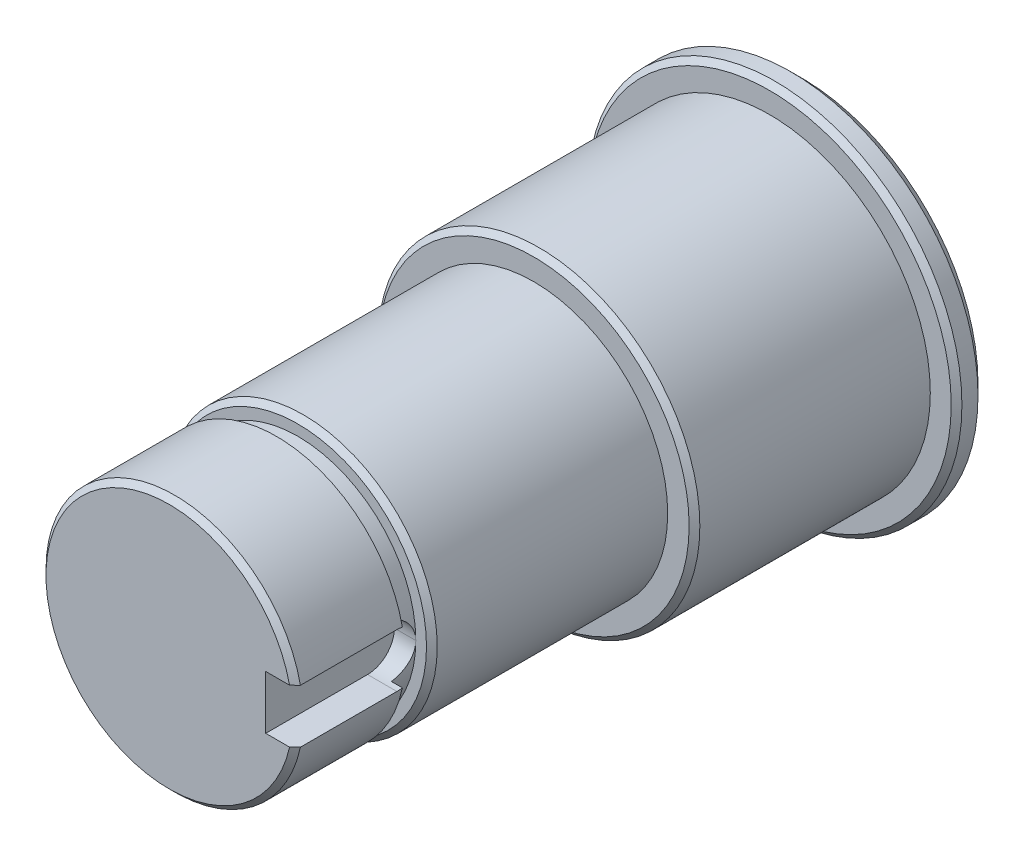
ISO-10303-21;
HEADER;
FILE_DESCRIPTION(('STEP AP214'),'2;1');
FILE_NAME('part.step','',(''),(''),'','','');
FILE_SCHEMA(('AUTOMOTIVE_DESIGN { 1 0 10303 214 1 1 1 1 }'));
ENDSEC;
DATA;
#1=APPLICATION_CONTEXT('core data for automotive mechanical design processes');
#2=APPLICATION_PROTOCOL_DEFINITION('international standard','automotive_design',2000,#1);
#3=PRODUCT_CONTEXT('',#1,'mechanical');
#4=PRODUCT('Part','Part','',(#3));
#5=PRODUCT_RELATED_PRODUCT_CATEGORY('part','',(#4));
#6=PRODUCT_DEFINITION_FORMATION('','',#4);
#7=PRODUCT_DEFINITION_CONTEXT('part definition',#1,'design');
#8=PRODUCT_DEFINITION('design','',#6,#7);
#9=PRODUCT_DEFINITION_SHAPE('','',#8);
#10=(LENGTH_UNIT() NAMED_UNIT(*) SI_UNIT(.MILLI.,.METRE.));
#11=(NAMED_UNIT(*) PLANE_ANGLE_UNIT() SI_UNIT($,.RADIAN.));
#12=(NAMED_UNIT(*) SI_UNIT($,.STERADIAN.) SOLID_ANGLE_UNIT());
#13=UNCERTAINTY_MEASURE_WITH_UNIT(LENGTH_MEASURE(1.E-05),#10,'distance_accuracy_value','');
#14=(GEOMETRIC_REPRESENTATION_CONTEXT(3) GLOBAL_UNCERTAINTY_ASSIGNED_CONTEXT((#13)) GLOBAL_UNIT_ASSIGNED_CONTEXT((#10,
#11,#12)) REPRESENTATION_CONTEXT('',''));
#15=CARTESIAN_POINT('',(0.,0.,0.));
#16=DIRECTION('',(0.,0.,1.));
#17=DIRECTION('',(1.,0.,0.));
#18=AXIS2_PLACEMENT_3D('',#15,#16,#17);
#19=CARTESIAN_POINT('',(0.,0.,47.));
#20=DIRECTION('',(0.,0.,1.));
#21=DIRECTION('',(1.,0.,0.));
#22=AXIS2_PLACEMENT_3D('',#19,#20,#21);
#23=PLANE('',#22);
#24=CARTESIAN_POINT('',(0.,0.,47.));
#25=DIRECTION('',(0.,0.,1.));
#26=DIRECTION('',(1.,0.,0.));
#27=AXIS2_PLACEMENT_3D('',#24,#25,#26);
#28=CIRCLE('',#27,11.);
#29=CARTESIAN_POINT('',(11.,0.,47.));
#30=VERTEX_POINT('',#29);
#31=EDGE_CURVE('E269',#30,#30,#28,.T.);
#32=ORIENTED_EDGE('',*,*,#31,.F.);
#33=EDGE_LOOP('',(#32));
#34=FACE_BOUND('',#33,.T.);
#35=CARTESIAN_POINT('',(0.,0.,47.));
#36=DIRECTION('',(0.,0.,1.));
#37=DIRECTION('',(1.,0.,0.));
#38=AXIS2_PLACEMENT_3D('',#35,#36,#37);
#39=CIRCLE('',#38,12.);
#40=CARTESIAN_POINT('',(12.,0.,47.));
#41=VERTEX_POINT('',#40);
#42=EDGE_CURVE('E233',#41,#41,#39,.T.);
#43=ORIENTED_EDGE('',*,*,#42,.T.);
#44=EDGE_LOOP('',(#43));
#45=FACE_BOUND('',#44,.T.);
#46=ADVANCED_FACE('F30',(#34,#45),#23,.T.);
#47=CARTESIAN_POINT('',(0.,0.,25.));
#48=DIRECTION('',(0.,0.,1.));
#49=DIRECTION('',(1.,0.,0.));
#50=AXIS2_PLACEMENT_3D('',#47,#48,#49);
#51=PLANE('',#50);
#52=CARTESIAN_POINT('',(0.,0.,25.));
#53=DIRECTION('',(0.,0.,1.));
#54=DIRECTION('',(1.,0.,0.));
#55=AXIS2_PLACEMENT_3D('',#52,#53,#54);
#56=CIRCLE('',#55,14.5);
#57=CARTESIAN_POINT('',(14.5,0.,25.));
#58=VERTEX_POINT('',#57);
#59=EDGE_CURVE('E220',#58,#58,#56,.T.);
#60=ORIENTED_EDGE('',*,*,#59,.T.);
#61=EDGE_LOOP('',(#60));
#62=FACE_BOUND('',#61,.T.);
#63=CARTESIAN_POINT('',(0.,0.,25.));
#64=DIRECTION('',(0.,0.,1.));
#65=DIRECTION('',(1.,0.,0.));
#66=AXIS2_PLACEMENT_3D('',#63,#64,#65);
#67=CIRCLE('',#66,12.5);
#68=CARTESIAN_POINT('',(12.5,0.,25.));
#69=VERTEX_POINT('',#68);
#70=EDGE_CURVE('E277',#69,#69,#67,.T.);
#71=ORIENTED_EDGE('',*,*,#70,.F.);
#72=EDGE_LOOP('',(#71));
#73=FACE_BOUND('',#72,.T.);
#74=ADVANCED_FACE('F187',(#62,#73),#51,.T.);
#75=CARTESIAN_POINT('',(0.,0.,3.));
#76=DIRECTION('',(0.,0.,1.));
#77=DIRECTION('',(1.,0.,0.));
#78=AXIS2_PLACEMENT_3D('',#75,#76,#77);
#79=PLANE('',#78);
#80=CARTESIAN_POINT('',(0.,0.,3.));
#81=DIRECTION('',(0.,0.,1.));
#82=DIRECTION('',(1.,0.,0.));
#83=AXIS2_PLACEMENT_3D('',#80,#81,#82);
#84=CIRCLE('',#83,16.95);
#85=CARTESIAN_POINT('',(16.95,0.,3.));
#86=VERTEX_POINT('',#85);
#87=EDGE_CURVE('E221',#86,#86,#84,.T.);
#88=ORIENTED_EDGE('',*,*,#87,.T.);
#89=EDGE_LOOP('',(#88));
#90=FACE_BOUND('',#89,.T.);
#91=CARTESIAN_POINT('',(0.,0.,3.));
#92=DIRECTION('',(0.,0.,1.));
#93=DIRECTION('',(1.,0.,0.));
#94=AXIS2_PLACEMENT_3D('',#91,#92,#93);
#95=CIRCLE('',#94,15.);
#96=CARTESIAN_POINT('',(15.,0.,3.));
#97=VERTEX_POINT('',#96);
#98=EDGE_CURVE('E280',#97,#97,#95,.T.);
#99=ORIENTED_EDGE('',*,*,#98,.F.);
#100=EDGE_LOOP('',(#99));
#101=FACE_BOUND('',#100,.T.);
#102=ADVANCED_FACE('F196',(#90,#101),#79,.T.);
#103=CARTESIAN_POINT('',(0.,0.,3.));
#104=DIRECTION('',(0.,0.,-1.));
#105=DIRECTION('',(-1.,0.,0.));
#106=AXIS2_PLACEMENT_3D('',#103,#104,#105);
#107=CYLINDRICAL_SURFACE('',#106,17.45);
#108=CARTESIAN_POINT('',(0.,0.,1.));
#109=DIRECTION('',(0.,0.,1.));
#110=DIRECTION('',(1.,0.,0.));
#111=AXIS2_PLACEMENT_3D('',#108,#109,#110);
#112=CIRCLE('',#111,17.45);
#113=CARTESIAN_POINT('',(17.45,0.,1.));
#114=VERTEX_POINT('',#113);
#115=EDGE_CURVE('E215',#114,#114,#112,.T.);
#116=ORIENTED_EDGE('',*,*,#115,.T.);
#117=EDGE_LOOP('',(#116));
#118=FACE_BOUND('',#117,.T.);
#119=CARTESIAN_POINT('',(0.,0.,2.50000000000002));
#120=DIRECTION('',(0.,0.,1.));
#121=DIRECTION('',(1.,0.,0.));
#122=AXIS2_PLACEMENT_3D('',#119,#120,#121);
#123=CIRCLE('',#122,17.45);
#124=CARTESIAN_POINT('',(17.45,0.,2.50000000000002));
#125=VERTEX_POINT('',#124);
#126=EDGE_CURVE('E218',#125,#125,#123,.F.);
#127=ORIENTED_EDGE('',*,*,#126,.T.);
#128=EDGE_LOOP('',(#127));
#129=FACE_BOUND('',#128,.T.);
#130=ADVANCED_FACE('F204',(#118,#129),#107,.T.);
#131=CARTESIAN_POINT('',(0.,0.,0.));
#132=DIRECTION('',(0.,0.,1.));
#133=DIRECTION('',(1.,0.,0.));
#134=AXIS2_PLACEMENT_3D('',#131,#132,#133);
#135=PLANE('',#134);
#136=CARTESIAN_POINT('',(0.,0.,0.));
#137=DIRECTION('',(0.,0.,1.));
#138=DIRECTION('',(1.,0.,0.));
#139=AXIS2_PLACEMENT_3D('',#136,#137,#138);
#140=CIRCLE('',#139,16.45);
#141=CARTESIAN_POINT('',(16.45,0.,0.));
#142=VERTEX_POINT('',#141);
#143=EDGE_CURVE('E240',#142,#142,#140,.F.);
#144=ORIENTED_EDGE('',*,*,#143,.T.);
#145=EDGE_LOOP('',(#144));
#146=FACE_BOUND('',#145,.T.);
#147=ADVANCED_FACE('F200',(#146),#135,.F.);
#148=CARTESIAN_POINT('',(0.,0.,25.));
#149=DIRECTION('',(0.,0.,-1.));
#150=DIRECTION('',(-1.,0.,0.));
#151=AXIS2_PLACEMENT_3D('',#148,#149,#150);
#152=CYLINDRICAL_SURFACE('',#151,15.);
#153=CARTESIAN_POINT('',(0.,0.,24.5));
#154=DIRECTION('',(0.,0.,1.));
#155=DIRECTION('',(1.,0.,0.));
#156=AXIS2_PLACEMENT_3D('',#153,#154,#155);
#157=CIRCLE('',#156,15.);
#158=CARTESIAN_POINT('',(15.,0.,24.5));
#159=VERTEX_POINT('',#158);
#160=EDGE_CURVE('E224',#159,#159,#157,.F.);
#161=ORIENTED_EDGE('',*,*,#160,.T.);
#162=EDGE_LOOP('',(#161));
#163=FACE_BOUND('',#162,.T.);
#164=ORIENTED_EDGE('',*,*,#98,.T.);
#165=EDGE_LOOP('',(#164));
#166=FACE_BOUND('',#165,.T.);
#167=ADVANCED_FACE('F192',(#163,#166),#152,.T.);
#168=CARTESIAN_POINT('',(0.,0.,47.));
#169=DIRECTION('',(0.,0.,-1.));
#170=DIRECTION('',(-1.,0.,0.));
#171=AXIS2_PLACEMENT_3D('',#168,#169,#170);
#172=CYLINDRICAL_SURFACE('',#171,12.5);
#173=CARTESIAN_POINT('',(0.,0.,46.5));
#174=DIRECTION('',(0.,0.,1.));
#175=DIRECTION('',(1.,0.,0.));
#176=AXIS2_PLACEMENT_3D('',#173,#174,#175);
#177=CIRCLE('',#176,12.5);
#178=CARTESIAN_POINT('',(12.5,0.,46.5));
#179=VERTEX_POINT('',#178);
#180=EDGE_CURVE('E236',#179,#179,#177,.F.);
#181=ORIENTED_EDGE('',*,*,#180,.T.);
#182=EDGE_LOOP('',(#181));
#183=FACE_BOUND('',#182,.T.);
#184=ORIENTED_EDGE('',*,*,#70,.T.);
#185=EDGE_LOOP('',(#184));
#186=FACE_BOUND('',#185,.T.);
#187=ADVANCED_FACE('F189',(#183,#186),#172,.T.);
#188=CARTESIAN_POINT('',(-12.,0.,49.));
#189=DIRECTION('',(0.,0.,-1.));
#190=DIRECTION('',(-1.,0.,0.));
#191=AXIS2_PLACEMENT_3D('',#188,#189,#190);
#192=PLANE('',#191);
#193=CARTESIAN_POINT('',(0.,0.,49.));
#194=DIRECTION('',(0.,0.,1.));
#195=DIRECTION('',(1.,0.,0.));
#196=AXIS2_PLACEMENT_3D('',#193,#194,#195);
#197=CIRCLE('',#196,12.);
#198=CARTESIAN_POINT('',(11.7473401244707,2.44948974278318,49.));
#199=VERTEX_POINT('',#198);
#200=CARTESIAN_POINT('',(11.7473401244707,-2.44948974278318,49.));
#201=VERTEX_POINT('',#200);
#202=EDGE_CURVE('E53',#199,#201,#197,.T.);
#203=ORIENTED_EDGE('',*,*,#202,.F.);
#204=DIRECTION('',(1.,0.,0.));
#205=VECTOR('',#204,1.);
#206=CARTESIAN_POINT('',(11.7473401244707,2.44948974278318,49.));
#207=LINE('',#206,#205);
#208=CARTESIAN_POINT('',(10.7238052947636,2.44948974278318,49.));
#209=VERTEX_POINT('',#208);
#210=EDGE_CURVE('E40',#199,#209,#207,.F.);
#211=ORIENTED_EDGE('',*,*,#210,.T.);
#212=CARTESIAN_POINT('',(0.,0.,49.));
#213=DIRECTION('',(0.,0.,1.));
#214=DIRECTION('',(1.,0.,0.));
#215=AXIS2_PLACEMENT_3D('',#212,#213,#214);
#216=CIRCLE('',#215,11.);
#217=CARTESIAN_POINT('',(10.7238052947636,-2.44948974278318,49.));
#218=VERTEX_POINT('',#217);
#219=EDGE_CURVE('E46',#209,#218,#216,.T.);
#220=ORIENTED_EDGE('',*,*,#219,.T.);
#221=DIRECTION('',(1.,0.,0.));
#222=VECTOR('',#221,1.);
#223=CARTESIAN_POINT('',(10.7238052947636,-2.44948974278318,49.));
#224=LINE('',#223,#222);
#225=EDGE_CURVE('E251',#218,#201,#224,.T.);
#226=ORIENTED_EDGE('',*,*,#225,.T.);
#227=EDGE_LOOP('',(#203,#211,#220,#226));
#228=FACE_BOUND('',#227,.T.);
#229=ADVANCED_FACE('F153',(#228),#192,.T.);
#230=CARTESIAN_POINT('',(0.,0.,47.));
#231=DIRECTION('',(0.,0.,1.));
#232=DIRECTION('',(1.,0.,0.));
#233=AXIS2_PLACEMENT_3D('',#230,#231,#232);
#234=CYLINDRICAL_SURFACE('',#233,11.);
#235=ORIENTED_EDGE('',*,*,#219,.F.);
#236=CARTESIAN_POINT('',(10.7238052947636,2.44948974278318,49.));
#237=CARTESIAN_POINT('',(10.7270051705199,2.43546225899013,48.931243733876));
#238=CARTESIAN_POINT('',(10.7308472430649,2.4185332172087,48.863116600116));
#239=CARTESIAN_POINT('',(10.7396733144426,2.37904398302326,48.7286032390526));
#240=CARTESIAN_POINT('',(10.7446571019522,2.35648483264184,48.6622166921103));
#241=CARTESIAN_POINT('',(10.7556191746092,2.30593085549429,48.5317157686606));
#242=CARTESIAN_POINT('',(10.7615963199518,2.27794225253788,48.4675988889972));
#243=CARTESIAN_POINT('',(10.7743690019728,2.21674323751611,48.3420124820564));
#244=CARTESIAN_POINT('',(10.7811645590626,2.18353269520733,48.2805430208586));
#245=CARTESIAN_POINT('',(10.8024886103983,2.07642538610297,48.1007598772238));
#246=CARTESIAN_POINT('',(10.8179673183631,1.99499657533367,47.9869265661249));
#247=CARTESIAN_POINT('',(10.8497084698245,1.81444249446593,47.7745283943104));
#248=CARTESIAN_POINT('',(10.8659708929459,1.71531768425152,47.6759631369326));
#249=CARTESIAN_POINT('',(10.8977266444628,1.50049814289524,47.4953906129537));
#250=CARTESIAN_POINT('',(10.9132064310626,1.38459554614731,47.4136279435977));
#251=CARTESIAN_POINT('',(10.9414244876216,1.14030197084631,47.2707153825588));
#252=CARTESIAN_POINT('',(10.9541625336447,1.01190997344301,47.2095671743658));
#253=CARTESIAN_POINT('',(10.9704105104604,0.809351066191613,47.1334524532352));
#254=CARTESIAN_POINT('',(10.9754351831543,0.738267522283218,47.1103238093824));
#255=CARTESIAN_POINT('',(10.9841751056629,0.594217360443672,47.0704974185992));
#256=CARTESIAN_POINT('',(10.9878902975281,0.521250659328935,47.0537999562701));
#257=CARTESIAN_POINT('',(10.9938910426588,0.373896866857208,47.0269815155051));
#258=CARTESIAN_POINT('',(10.9961734033692,0.299506981503699,47.0168752212132));
#259=CARTESIAN_POINT('',(10.9992322885864,0.150080006961188,47.0033786463336));
#260=CARTESIAN_POINT('',(11.0000086070291,0.0750428306172654,46.9999892847885));
#261=CARTESIAN_POINT('',(11.,0.,47.));
#262=B_SPLINE_CURVE_WITH_KNOTS('',3,(#236,#237,#238,#239,#240,#241,#242,#243,#244,#245,#246,
#247,#248,#249,#250,#251,#252,#253,#254,#255,#256,#257,#258,#259,#260,#261),.UNSPECIFIED.,.F.,
.F.,(4,2,2,2,2,2,2,2,2,2,2,2,4),(0.,0.210660221626525,0.421281483058337,0.63166271990242,
0.842049204819849,1.26236009853302,1.68266007078708,2.10870184822357,2.5347784101445,
2.75927755192977,2.98378662741285,3.20879418251605,3.43383252209369),.UNSPECIFIED.);
#263=EDGE_CURVE('E11',#209,#30,#262,.T.);
#264=ORIENTED_EDGE('',*,*,#263,.T.);
#265=ORIENTED_EDGE('',*,*,#31,.T.);
#266=CARTESIAN_POINT('',(11.,0.,47.));
#267=CARTESIAN_POINT('',(11.0000062631547,-0.069359381459432,46.999992262271));
#268=CARTESIAN_POINT('',(10.9993441314012,-0.138714425845161,47.0028863317969));
#269=CARTESIAN_POINT('',(10.9967294954615,-0.276911622073988,47.0144181134769));
#270=CARTESIAN_POINT('',(10.9947771685423,-0.34575384306284,47.0230550365901));
#271=CARTESIAN_POINT('',(10.9896323569216,-0.482339061487068,47.0459955464892));
#272=CARTESIAN_POINT('',(10.9864417172471,-0.550083538801368,47.060290703403));
#273=CARTESIAN_POINT('',(10.9789138060964,-0.684078822224271,47.0944184625271));
#274=CARTESIAN_POINT('',(10.9745765265885,-0.750329617866717,47.1142511035254));
#275=CARTESIAN_POINT('',(10.9600119469312,-0.946146681937324,47.1818475254434));
#276=CARTESIAN_POINT('',(10.9482269417514,-1.07290109579769,47.237730718352));
#277=CARTESIAN_POINT('',(10.9217780612989,-1.31516951073417,47.3694206862865));
#278=CARTESIAN_POINT('',(10.9071141049751,-1.43068319521312,47.4452280222572));
#279=CARTESIAN_POINT('',(10.8762285824708,-1.64924932157864,47.6159878880607));
#280=CARTESIAN_POINT('',(10.8599865626537,-1.75208327323788,47.7112164268576));
#281=CARTESIAN_POINT('',(10.8279077936482,-1.94050909601812,47.9176173677905));
#282=CARTESIAN_POINT('',(10.8120711580757,-2.02609617860548,48.0287941832835));
#283=CARTESIAN_POINT('',(10.7892162201439,-2.14350613360819,48.2110736899603));
#284=CARTESIAN_POINT('',(10.7814318234941,-2.18221189191061,48.2777490533691));
#285=CARTESIAN_POINT('',(10.7667875194561,-2.2533538162822,48.4144908101737));
#286=CARTESIAN_POINT('',(10.7599276761639,-2.28578954774089,48.4845574382164));
#287=CARTESIAN_POINT('',(10.7473696764176,-2.34413060685169,48.6276291755192));
#288=CARTESIAN_POINT('',(10.7416739914829,-2.37002206795434,48.7006401504273));
#289=CARTESIAN_POINT('',(10.731658229854,-2.4149547687399,48.8488438458625));
#290=CARTESIAN_POINT('',(10.7273383743449,-2.43399490703441,48.9240369150758));
#291=CARTESIAN_POINT('',(10.7238052947636,-2.44948974278318,49.));
#292=B_SPLINE_CURVE_WITH_KNOTS('',3,(#266,#267,#268,#269,#270,#271,#272,#273,#274,#275,#276,
#277,#278,#279,#280,#281,#282,#283,#284,#285,#286,#287,#288,#289,#290,#291),.UNSPECIFIED.,.F.,
.F.,(4,2,2,2,2,2,2,2,2,2,2,2,4),(0.,0.208007086133319,0.415985598977219,0.623655416077706,
0.83132668785895,1.24629798955501,1.66128097561199,2.08263375686062,2.50410336455458,
2.73628198310806,2.96847668948851,3.20115934119784,3.43387938124956),.UNSPECIFIED.);
#293=EDGE_CURVE('E157',#30,#218,#292,.T.);
#294=ORIENTED_EDGE('',*,*,#293,.T.);
#295=EDGE_LOOP('',(#235,#264,#265,#294));
#296=FACE_BOUND('',#295,.T.);
#297=ADVANCED_FACE('F149',(#296),#234,.T.);
#298=CARTESIAN_POINT('',(0.,0.,59.));
#299=DIRECTION('',(0.,0.,1.));
#300=DIRECTION('',(1.,0.,0.));
#301=AXIS2_PLACEMENT_3D('',#298,#299,#300);
#302=PLANE('',#301);
#303=DIRECTION('',(1.,0.,0.));
#304=VECTOR('',#303,1.);
#305=CARTESIAN_POINT('',(9.,2.5,59.));
#306=LINE('',#305,#304);
#307=CARTESIAN_POINT('',(9.,2.5,59.));
#308=VERTEX_POINT('',#307);
#309=CARTESIAN_POINT('',(11.2249721603218,2.5,59.));
#310=VERTEX_POINT('',#309);
#311=EDGE_CURVE('E122',#308,#310,#306,.T.);
#312=ORIENTED_EDGE('',*,*,#311,.T.);
#313=CARTESIAN_POINT('',(0.,0.,59.));
#314=DIRECTION('',(0.,0.,1.));
#315=DIRECTION('',(1.,0.,0.));
#316=AXIS2_PLACEMENT_3D('',#313,#314,#315);
#317=CIRCLE('',#316,11.5);
#318=CARTESIAN_POINT('',(11.2249721603218,-2.5,59.));
#319=VERTEX_POINT('',#318);
#320=EDGE_CURVE('E121',#310,#319,#317,.T.);
#321=ORIENTED_EDGE('',*,*,#320,.T.);
#322=DIRECTION('',(1.,0.,0.));
#323=VECTOR('',#322,1.);
#324=CARTESIAN_POINT('',(9.,-2.5,59.));
#325=LINE('',#324,#323);
#326=CARTESIAN_POINT('',(9.,-2.5,59.));
#327=VERTEX_POINT('',#326);
#328=EDGE_CURVE('E103',#327,#319,#325,.T.);
#329=ORIENTED_EDGE('',*,*,#328,.F.);
#330=DIRECTION('',(0.,-1.,0.));
#331=VECTOR('',#330,1.);
#332=CARTESIAN_POINT('',(9.,2.5,59.));
#333=LINE('',#332,#331);
#334=EDGE_CURVE('E109',#308,#327,#333,.T.);
#335=ORIENTED_EDGE('',*,*,#334,.F.);
#336=EDGE_LOOP('',(#312,#321,#329,#335));
#337=FACE_BOUND('',#336,.T.);
#338=ADVANCED_FACE('F119',(#337),#302,.T.);
#339=CARTESIAN_POINT('',(0.,0.,59.));
#340=DIRECTION('',(0.,0.,-1.));
#341=DIRECTION('',(-1.,0.,0.));
#342=AXIS2_PLACEMENT_3D('',#339,#340,#341);
#343=CONICAL_SURFACE('',#342,11.5,0.785398163397426);
#344=CARTESIAN_POINT('',(15.1691571018033,2.5,55.1262129851102));
#345=CARTESIAN_POINT('',(14.8366974693419,2.5,55.4542453168992));
#346=CARTESIAN_POINT('',(14.5040984318175,2.5,55.7821362155036));
#347=CARTESIAN_POINT('',(13.8385504552705,2.5,56.4375624320658));
#348=CARTESIAN_POINT('',(13.5056015163792,2.5,56.7650977501571));
#349=CARTESIAN_POINT('',(12.5061389650565,2.5,57.747045785368));
#350=CARTESIAN_POINT('',(11.838993529945,2.5,58.4008164710457));
#351=CARTESIAN_POINT('',(10.8362127583897,2.5,59.3793762260795));
#352=CARTESIAN_POINT('',(10.5016044799481,2.5,59.7052175462295));
#353=CARTESIAN_POINT('',(9.83147783643002,2.5,60.355961176446));
#354=CARTESIAN_POINT('',(9.49595947437386,2.5,60.6808634896214));
#355=CARTESIAN_POINT('',(8.82369277325796,2.5,61.3294114340963));
#356=CARTESIAN_POINT('',(8.48694440368595,2.5,61.6530570338045));
#357=CARTESIAN_POINT('',(7.98054105571642,2.5,62.1371897673921));
#358=CARTESIAN_POINT('',(7.81152552701392,2.5,62.2983456301894));
#359=CARTESIAN_POINT('',(7.47297586457772,2.5,62.6201126903093));
#360=CARTESIAN_POINT('',(7.30344172917194,2.5,62.7807238858722));
#361=CARTESIAN_POINT('',(7.13360268921164,2.5,62.9410128107316));
#362=B_SPLINE_CURVE_WITH_KNOTS('',3,(#344,#345,#346,#347,#348,#349,#350,#351,#352,#353,#354,
#355,#356,#357,#358,#359,#360,#361),.UNSPECIFIED.,.F.,.F.,(4,2,2,2,2,2,2,2,4),(0.,
1.40114621158888,2.80229189732206,5.60451543695996,7.00566270301271,8.4068053246923,
9.8079829432378,10.5085795747689,11.2091784675359),.UNSPECIFIED.);
#363=CARTESIAN_POINT('',(11.7366945943055,2.5,58.5));
#364=VERTEX_POINT('',#363);
#365=EDGE_CURVE('E268',#364,#310,#362,.T.);
#366=ORIENTED_EDGE('',*,*,#365,.F.);
#367=CARTESIAN_POINT('',(0.,0.,58.5));
#368=DIRECTION('',(0.,0.,1.));
#369=DIRECTION('',(1.,0.,0.));
#370=AXIS2_PLACEMENT_3D('',#367,#368,#369);
#371=CIRCLE('',#370,12.);
#372=CARTESIAN_POINT('',(11.7366945943055,-2.5,58.5));
#373=VERTEX_POINT('',#372);
#374=EDGE_CURVE('E227',#373,#364,#371,.F.);
#375=ORIENTED_EDGE('',*,*,#374,.F.);
#376=CARTESIAN_POINT('',(7.13360268921164,-2.5,62.9410128107316));
#377=CARTESIAN_POINT('',(7.30344172917194,-2.5,62.7807238858722));
#378=CARTESIAN_POINT('',(7.47297586457773,-2.5,62.6201126903092));
#379=CARTESIAN_POINT('',(7.81152552701393,-2.5,62.2983456301894));
#380=CARTESIAN_POINT('',(7.98054105571642,-2.5,62.1371897673921));
#381=CARTESIAN_POINT('',(8.48694440368595,-2.5,61.6530570338044));
#382=CARTESIAN_POINT('',(8.82369277325796,-2.5,61.3294114340963));
#383=CARTESIAN_POINT('',(9.49595947437385,-2.5,60.6808634896214));
#384=CARTESIAN_POINT('',(9.83147783643001,-2.5,60.355961176446));
#385=CARTESIAN_POINT('',(10.5016044799481,-2.5,59.7052175462295));
#386=CARTESIAN_POINT('',(10.8362127583897,-2.5,59.3793762260795));
#387=CARTESIAN_POINT('',(11.838993529945,-2.5,58.4008164710457));
#388=CARTESIAN_POINT('',(12.5061389650566,-2.5,57.747045785368));
#389=CARTESIAN_POINT('',(13.5056015163792,-2.5,56.7650977501571));
#390=CARTESIAN_POINT('',(13.8385504552705,-2.5,56.4375624320658));
#391=CARTESIAN_POINT('',(14.5040984318175,-2.5,55.7821362155036));
#392=CARTESIAN_POINT('',(14.8366974693419,-2.5,55.4542453168992));
#393=CARTESIAN_POINT('',(15.1691571018033,-2.5,55.1262129851102));
#394=B_SPLINE_CURVE_WITH_KNOTS('',3,(#376,#377,#378,#379,#380,#381,#382,#383,#384,#385,#386,
#387,#388,#389,#390,#391,#392,#393),.UNSPECIFIED.,.F.,.F.,(4,2,2,2,2,2,2,2,4),(0.,
0.700598892766995,1.40119552429811,2.8023731428436,4.20351576452319,5.60466303057594,
8.40688657021384,9.80803225594702,11.2091784675359),.UNSPECIFIED.);
#395=EDGE_CURVE('E129',#319,#373,#394,.T.);
#396=ORIENTED_EDGE('',*,*,#395,.F.);
#397=ORIENTED_EDGE('',*,*,#320,.F.);
#398=EDGE_LOOP('',(#366,#375,#396,#397));
#399=FACE_BOUND('',#398,.T.);
#400=ADVANCED_FACE('F138',(#399),#343,.T.);
#401=CARTESIAN_POINT('',(0.,0.,59.));
#402=DIRECTION('',(0.,0.,-1.));
#403=DIRECTION('',(-1.,0.,0.));
#404=AXIS2_PLACEMENT_3D('',#401,#402,#403);
#405=CYLINDRICAL_SURFACE('',#404,12.);
#406=ORIENTED_EDGE('',*,*,#374,.T.);
#407=DIRECTION('',(0.,0.,-1.));
#408=VECTOR('',#407,1.);
#409=CARTESIAN_POINT('',(11.7366945943055,2.5,59.));
#410=LINE('',#409,#408);
#411=CARTESIAN_POINT('',(11.7366945943055,2.5,49.5));
#412=VERTEX_POINT('',#411);
#413=EDGE_CURVE('E136',#364,#412,#410,.T.);
#414=ORIENTED_EDGE('',*,*,#413,.T.);
#415=CARTESIAN_POINT('',(11.7366945943055,2.5,49.5));
#416=CARTESIAN_POINT('',(11.7367140999484,2.49997489475119,49.4157814133649));
#417=CARTESIAN_POINT('',(11.7376109802893,2.49575315399786,49.3320054532456));
#418=CARTESIAN_POINT('',(11.7411594903559,2.47891640153729,49.1653387865848));
#419=CARTESIAN_POINT('',(11.74381112007,2.46630138988501,49.0824480800373));
#420=CARTESIAN_POINT('',(11.7473401244707,2.44948974278318,49.));
#421=B_SPLINE_CURVE_WITH_KNOTS('',3,(#415,#416,#417,#418,#419,#420),.UNSPECIFIED.,.F.,.F.,(4,2,
4),(0.,0.251661182642634,0.503322363637159),.UNSPECIFIED.);
#422=EDGE_CURVE('E168',#412,#199,#421,.T.);
#423=ORIENTED_EDGE('',*,*,#422,.T.);
#424=ORIENTED_EDGE('',*,*,#202,.T.);
#425=CARTESIAN_POINT('',(11.7473401244707,-2.44948974278318,49.));
#426=CARTESIAN_POINT('',(11.74381112007,-2.46630138988501,49.0824480800373));
#427=CARTESIAN_POINT('',(11.7411594903559,-2.47891640153729,49.1653387865848));
#428=CARTESIAN_POINT('',(11.7376109802893,-2.49575315399786,49.3320054532456));
#429=CARTESIAN_POINT('',(11.7367140999484,-2.49997489475119,49.4157814133649));
#430=CARTESIAN_POINT('',(11.7366945943055,-2.5,49.5));
#431=B_SPLINE_CURVE_WITH_KNOTS('',3,(#425,#426,#427,#428,#429,#430),.UNSPECIFIED.,.F.,.F.,(4,2,
4),(0.,0.251661180994525,0.503322363637159),.UNSPECIFIED.);
#432=CARTESIAN_POINT('',(11.7366945943055,-2.5,49.5));
#433=VERTEX_POINT('',#432);
#434=EDGE_CURVE('E174',#201,#433,#431,.T.);
#435=ORIENTED_EDGE('',*,*,#434,.T.);
#436=DIRECTION('',(0.,0.,-1.));
#437=VECTOR('',#436,1.);
#438=CARTESIAN_POINT('',(11.7366945943055,-2.5,59.));
#439=LINE('',#438,#437);
#440=EDGE_CURVE('E124',#433,#373,#439,.F.);
#441=ORIENTED_EDGE('',*,*,#440,.T.);
#442=EDGE_LOOP('',(#406,#414,#423,#424,#435,#441));
#443=FACE_BOUND('',#442,.T.);
#444=ADVANCED_FACE('F178',(#443),#405,.T.);
#445=CARTESIAN_POINT('',(0.,0.,3.));
#446=DIRECTION('',(0.,0.,-1.));
#447=DIRECTION('',(-1.,0.,0.));
#448=AXIS2_PLACEMENT_3D('',#445,#446,#447);
#449=CONICAL_SURFACE('',#448,16.95,0.785398163397445);
#450=ORIENTED_EDGE('',*,*,#126,.F.);
#451=EDGE_LOOP('',(#450));
#452=FACE_BOUND('',#451,.T.);
#453=ORIENTED_EDGE('',*,*,#87,.F.);
#454=EDGE_LOOP('',(#453));
#455=FACE_BOUND('',#454,.T.);
#456=ADVANCED_FACE('F182',(#452,#455),#449,.T.);
#457=CARTESIAN_POINT('',(0.,0.,25.));
#458=DIRECTION('',(0.,0.,-1.));
#459=DIRECTION('',(-1.,0.,0.));
#460=AXIS2_PLACEMENT_3D('',#457,#458,#459);
#461=CONICAL_SURFACE('',#460,14.5,0.78539816339744);
#462=ORIENTED_EDGE('',*,*,#160,.F.);
#463=EDGE_LOOP('',(#462));
#464=FACE_BOUND('',#463,.T.);
#465=ORIENTED_EDGE('',*,*,#59,.F.);
#466=EDGE_LOOP('',(#465));
#467=FACE_BOUND('',#466,.T.);
#468=ADVANCED_FACE('F295',(#464,#467),#461,.T.);
#469=CARTESIAN_POINT('',(0.,0.,47.));
#470=DIRECTION('',(0.,0.,-1.));
#471=DIRECTION('',(-1.,0.,0.));
#472=AXIS2_PLACEMENT_3D('',#469,#470,#471);
#473=CONICAL_SURFACE('',#472,12.,0.785398163397452);
#474=ORIENTED_EDGE('',*,*,#180,.F.);
#475=EDGE_LOOP('',(#474));
#476=FACE_BOUND('',#475,.T.);
#477=ORIENTED_EDGE('',*,*,#42,.F.);
#478=EDGE_LOOP('',(#477));
#479=FACE_BOUND('',#478,.T.);
#480=ADVANCED_FACE('F292',(#476,#479),#473,.T.);
#481=CARTESIAN_POINT('',(0.,0.,1.));
#482=DIRECTION('',(0.,0.,1.));
#483=DIRECTION('',(1.,0.,0.));
#484=AXIS2_PLACEMENT_3D('',#481,#482,#483);
#485=CONICAL_SURFACE('',#484,17.45,0.78539816339745);
#486=ORIENTED_EDGE('',*,*,#143,.F.);
#487=EDGE_LOOP('',(#486));
#488=FACE_BOUND('',#487,.T.);
#489=ORIENTED_EDGE('',*,*,#115,.F.);
#490=EDGE_LOOP('',(#489));
#491=FACE_BOUND('',#490,.T.);
#492=ADVANCED_FACE('F294',(#488,#491),#485,.T.);
#493=CARTESIAN_POINT('',(9.,2.5,59.));
#494=DIRECTION('',(0.,1.,0.));
#495=DIRECTION('',(0.,0.,1.));
#496=AXIS2_PLACEMENT_3D('',#493,#494,#495);
#497=PLANE('',#496);
#498=DIRECTION('',(0.,0.,1.));
#499=VECTOR('',#498,1.);
#500=CARTESIAN_POINT('',(9.,2.5,59.));
#501=LINE('',#500,#499);
#502=CARTESIAN_POINT('',(9.,2.5,49.5));
#503=VERTEX_POINT('',#502);
#504=EDGE_CURVE('E108',#503,#308,#501,.T.);
#505=ORIENTED_EDGE('',*,*,#504,.F.);
#506=DIRECTION('',(1.,0.,0.));
#507=VECTOR('',#506,1.);
#508=CARTESIAN_POINT('',(9.,2.5,49.5));
#509=LINE('',#508,#507);
#510=EDGE_CURVE('E247',#503,#412,#509,.T.);
#511=ORIENTED_EDGE('',*,*,#510,.T.);
#512=ORIENTED_EDGE('',*,*,#413,.F.);
#513=ORIENTED_EDGE('',*,*,#365,.T.);
#514=ORIENTED_EDGE('',*,*,#311,.F.);
#515=EDGE_LOOP('',(#505,#511,#512,#513,#514));
#516=FACE_BOUND('',#515,.T.);
#517=ADVANCED_FACE('F146',(#516),#497,.F.);
#518=CARTESIAN_POINT('',(9.,-2.5,59.));
#519=DIRECTION('',(0.,-1.,0.));
#520=DIRECTION('',(0.,0.,-1.));
#521=AXIS2_PLACEMENT_3D('',#518,#519,#520);
#522=PLANE('',#521);
#523=ORIENTED_EDGE('',*,*,#440,.F.);
#524=DIRECTION('',(1.,0.,0.));
#525=VECTOR('',#524,1.);
#526=CARTESIAN_POINT('',(9.,-2.5,49.5));
#527=LINE('',#526,#525);
#528=CARTESIAN_POINT('',(9.,-2.5,49.5));
#529=VERTEX_POINT('',#528);
#530=EDGE_CURVE('E106',#433,#529,#527,.F.);
#531=ORIENTED_EDGE('',*,*,#530,.T.);
#532=DIRECTION('',(0.,0.,-1.));
#533=VECTOR('',#532,1.);
#534=CARTESIAN_POINT('',(9.,-2.5,59.));
#535=LINE('',#534,#533);
#536=EDGE_CURVE('E97',#327,#529,#535,.T.);
#537=ORIENTED_EDGE('',*,*,#536,.F.);
#538=ORIENTED_EDGE('',*,*,#328,.T.);
#539=ORIENTED_EDGE('',*,*,#395,.T.);
#540=EDGE_LOOP('',(#523,#531,#537,#538,#539));
#541=FACE_BOUND('',#540,.T.);
#542=ADVANCED_FACE('F100',(#541),#522,.F.);
#543=CARTESIAN_POINT('',(9.,-2.5,59.));
#544=DIRECTION('',(1.,0.,0.));
#545=DIRECTION('',(0.,0.,-1.));
#546=AXIS2_PLACEMENT_3D('',#543,#544,#545);
#547=PLANE('',#546);
#548=ORIENTED_EDGE('',*,*,#536,.T.);
#549=CARTESIAN_POINT('',(9.,0.,49.5));
#550=DIRECTION('',(1.,0.,0.));
#551=DIRECTION('',(0.,0.,-1.));
#552=AXIS2_PLACEMENT_3D('',#549,#550,#551);
#553=CIRCLE('',#552,2.5);
#554=CARTESIAN_POINT('',(9.,0.,47.));
#555=VERTEX_POINT('',#554);
#556=EDGE_CURVE('E246',#529,#555,#553,.T.);
#557=ORIENTED_EDGE('',*,*,#556,.T.);
#558=CARTESIAN_POINT('',(9.,0.,49.5));
#559=DIRECTION('',(1.,0.,0.));
#560=DIRECTION('',(0.,0.,-1.));
#561=AXIS2_PLACEMENT_3D('',#558,#559,#560);
#562=CIRCLE('',#561,2.5);
#563=EDGE_CURVE('E244',#555,#503,#562,.T.);
#564=ORIENTED_EDGE('',*,*,#563,.T.);
#565=ORIENTED_EDGE('',*,*,#504,.T.);
#566=ORIENTED_EDGE('',*,*,#334,.T.);
#567=EDGE_LOOP('',(#548,#557,#564,#565,#566));
#568=FACE_BOUND('',#567,.T.);
#569=ADVANCED_FACE('F112',(#568),#547,.T.);
#570=CARTESIAN_POINT('',(9.,0.,49.5));
#571=DIRECTION('',(1.,0.,0.));
#572=DIRECTION('',(0.,0.,-1.));
#573=AXIS2_PLACEMENT_3D('',#570,#571,#572);
#574=CYLINDRICAL_SURFACE('',#573,2.5);
#575=ORIENTED_EDGE('',*,*,#510,.F.);
#576=ORIENTED_EDGE('',*,*,#563,.F.);
#577=DIRECTION('',(1.,0.,0.));
#578=VECTOR('',#577,1.);
#579=CARTESIAN_POINT('',(0.,0.,47.));
#580=LINE('',#579,#578);
#581=EDGE_CURVE('E35',#30,#555,#580,.F.);
#582=ORIENTED_EDGE('',*,*,#581,.F.);
#583=ORIENTED_EDGE('',*,*,#263,.F.);
#584=ORIENTED_EDGE('',*,*,#210,.F.);
#585=ORIENTED_EDGE('',*,*,#422,.F.);
#586=EDGE_LOOP('',(#575,#576,#582,#583,#584,#585));
#587=FACE_BOUND('',#586,.T.);
#588=ADVANCED_FACE('F32',(#587),#574,.F.);
#589=CARTESIAN_POINT('',(0.,0.,49.5));
#590=DIRECTION('',(1.,0.,0.));
#591=DIRECTION('',(0.,0.,-1.));
#592=AXIS2_PLACEMENT_3D('',#589,#590,#591);
#593=CYLINDRICAL_SURFACE('',#592,2.5);
#594=ORIENTED_EDGE('',*,*,#556,.F.);
#595=ORIENTED_EDGE('',*,*,#530,.F.);
#596=ORIENTED_EDGE('',*,*,#434,.F.);
#597=ORIENTED_EDGE('',*,*,#225,.F.);
#598=ORIENTED_EDGE('',*,*,#293,.F.);
#599=ORIENTED_EDGE('',*,*,#581,.T.);
#600=EDGE_LOOP('',(#594,#595,#596,#597,#598,#599));
#601=FACE_BOUND('',#600,.T.);
#602=ADVANCED_FACE('F259',(#601),#593,.F.);
#603=CLOSED_SHELL('',(#46,#74,#102,#130,#147,#167,#187,#229,#297,#338,#400,#444,#456,#468,#480,
#492,#517,#542,#569,#588,#602));
#604=MANIFOLD_SOLID_BREP('B2',#603);
#605=ADVANCED_BREP_SHAPE_REPRESENTATION('',(#18,#604),#14);
#606=SHAPE_DEFINITION_REPRESENTATION(#9,#605);
ENDSEC;
END-ISO-10303-21;
